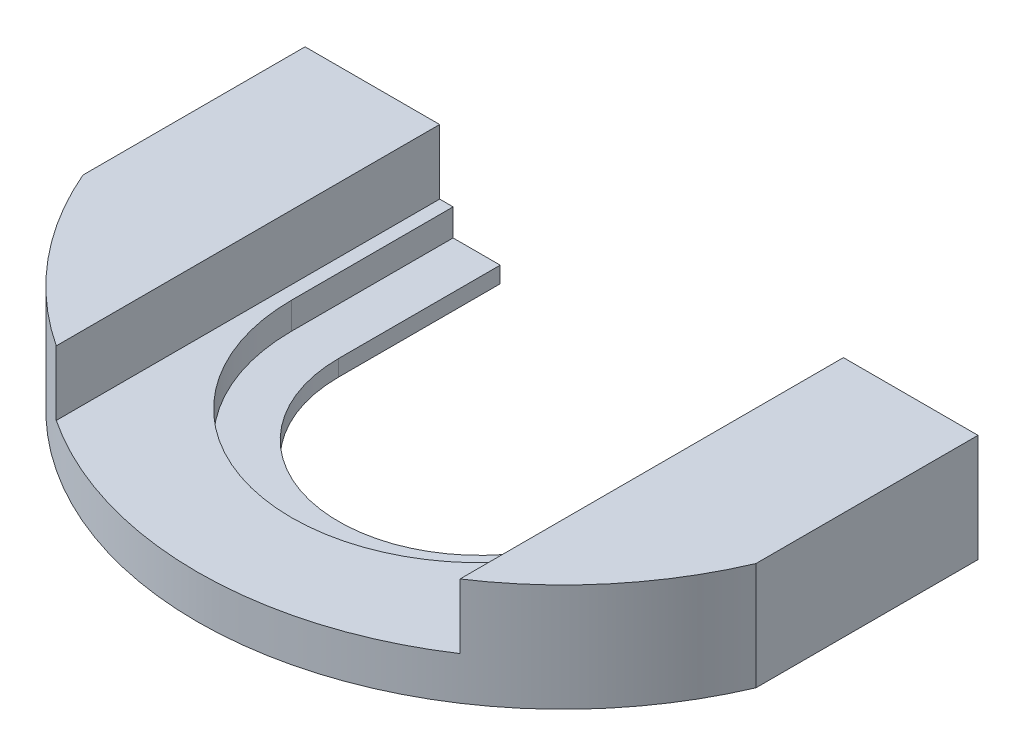
ISO-10303-21;
HEADER;
FILE_DESCRIPTION(('STEP AP214'),'2;1');
FILE_NAME('part.step','',(''),(''),'','','');
FILE_SCHEMA(('AUTOMOTIVE_DESIGN { 1 0 10303 214 1 1 1 1 }'));
ENDSEC;
DATA;
#1=APPLICATION_CONTEXT('core data for automotive mechanical design processes');
#2=APPLICATION_PROTOCOL_DEFINITION('international standard','automotive_design',2000,#1);
#3=PRODUCT_CONTEXT('',#1,'mechanical');
#4=PRODUCT('Part','Part','',(#3));
#5=PRODUCT_RELATED_PRODUCT_CATEGORY('part','',(#4));
#6=PRODUCT_DEFINITION_FORMATION('','',#4);
#7=PRODUCT_DEFINITION_CONTEXT('part definition',#1,'design');
#8=PRODUCT_DEFINITION('design','',#6,#7);
#9=PRODUCT_DEFINITION_SHAPE('','',#8);
#10=(LENGTH_UNIT() NAMED_UNIT(*) SI_UNIT(.MILLI.,.METRE.));
#11=(NAMED_UNIT(*) PLANE_ANGLE_UNIT() SI_UNIT($,.RADIAN.));
#12=(NAMED_UNIT(*) SI_UNIT($,.STERADIAN.) SOLID_ANGLE_UNIT());
#13=UNCERTAINTY_MEASURE_WITH_UNIT(LENGTH_MEASURE(1.E-05),#10,'distance_accuracy_value','');
#14=(GEOMETRIC_REPRESENTATION_CONTEXT(3) GLOBAL_UNCERTAINTY_ASSIGNED_CONTEXT((#13)) GLOBAL_UNIT_ASSIGNED_CONTEXT((#10,
#11,#12)) REPRESENTATION_CONTEXT('',''));
#15=CARTESIAN_POINT('',(0.,0.,0.));
#16=DIRECTION('',(0.,0.,1.));
#17=DIRECTION('',(1.,0.,0.));
#18=AXIS2_PLACEMENT_3D('',#15,#16,#17);
#19=CARTESIAN_POINT('',(-30.,1.2,33.));
#20=DIRECTION('',(0.,1.,0.));
#21=DIRECTION('',(-1.,0.,0.));
#22=AXIS2_PLACEMENT_3D('',#19,#20,#21);
#23=PLANE('',#22);
#24=DIRECTION('',(1.,0.,0.));
#25=VECTOR('',#24,1.);
#26=CARTESIAN_POINT('',(-30.,1.2,0.));
#27=LINE('',#26,#25);
#28=CARTESIAN_POINT('',(-29.,1.2,0.));
#29=VERTEX_POINT('',#28);
#30=CARTESIAN_POINT('',(-25.5,1.2,0.));
#31=VERTEX_POINT('',#30);
#32=EDGE_CURVE('E268',#29,#31,#27,.T.);
#33=ORIENTED_EDGE('',*,*,#32,.F.);
#34=DIRECTION('',(0.,0.,-1.));
#35=VECTOR('',#34,1.);
#36=CARTESIAN_POINT('',(-29.,1.2,0.));
#37=LINE('',#36,#35);
#38=CARTESIAN_POINT('',(-29.,1.2,12.));
#39=VERTEX_POINT('',#38);
#40=EDGE_CURVE('E132',#39,#29,#37,.T.);
#41=ORIENTED_EDGE('',*,*,#40,.F.);
#42=CARTESIAN_POINT('',(-15.,1.2,12.));
#43=DIRECTION('',(0.,1.,0.));
#44=DIRECTION('',(-1.,0.,0.));
#45=AXIS2_PLACEMENT_3D('',#42,#43,#44);
#46=CIRCLE('',#45,14.);
#47=CARTESIAN_POINT('',(-0.999999999999994,1.2,12.));
#48=VERTEX_POINT('',#47);
#49=EDGE_CURVE('E137',#39,#48,#46,.T.);
#50=ORIENTED_EDGE('',*,*,#49,.T.);
#51=DIRECTION('',(0.,0.,-1.));
#52=VECTOR('',#51,1.);
#53=CARTESIAN_POINT('',(-0.999999999999992,1.2,0.));
#54=LINE('',#53,#52);
#55=CARTESIAN_POINT('',(-0.999999999999994,1.2,0.));
#56=VERTEX_POINT('',#55);
#57=EDGE_CURVE('E365',#48,#56,#54,.T.);
#58=ORIENTED_EDGE('',*,*,#57,.T.);
#59=CARTESIAN_POINT('',(-4.49999999999999,1.2,0.));
#60=VERTEX_POINT('',#59);
#61=EDGE_CURVE('E265',#60,#56,#27,.T.);
#62=ORIENTED_EDGE('',*,*,#61,.F.);
#63=DIRECTION('',(0.,0.,1.));
#64=VECTOR('',#63,1.);
#65=CARTESIAN_POINT('',(-4.49999999999999,1.2,33.));
#66=LINE('',#65,#64);
#67=CARTESIAN_POINT('',(-4.49999999999999,1.2,12.));
#68=VERTEX_POINT('',#67);
#69=EDGE_CURVE('E125',#60,#68,#66,.T.);
#70=ORIENTED_EDGE('',*,*,#69,.T.);
#71=CARTESIAN_POINT('',(-15.,1.2,12.));
#72=DIRECTION('',(0.,1.,0.));
#73=DIRECTION('',(-1.,0.,0.));
#74=AXIS2_PLACEMENT_3D('',#71,#72,#73);
#75=CIRCLE('',#74,10.5);
#76=CARTESIAN_POINT('',(-25.5,1.19999999999999,12.));
#77=VERTEX_POINT('',#76);
#78=EDGE_CURVE('E312',#77,#68,#75,.T.);
#79=ORIENTED_EDGE('',*,*,#78,.F.);
#80=DIRECTION('',(0.,0.,1.));
#81=VECTOR('',#80,1.);
#82=CARTESIAN_POINT('',(-25.5,1.2,33.));
#83=LINE('',#82,#81);
#84=EDGE_CURVE('E317',#31,#77,#83,.T.);
#85=ORIENTED_EDGE('',*,*,#84,.F.);
#86=EDGE_LOOP('',(#33,#41,#50,#58,#62,#70,#79,#85));
#87=FACE_BOUND('',#86,.T.);
#88=ADVANCED_FACE('F118',(#87),#23,.T.);
#89=CARTESIAN_POINT('',(0.,0.,0.));
#90=DIRECTION('',(0.,0.,1.));
#91=DIRECTION('',(1.,0.,0.));
#92=AXIS2_PLACEMENT_3D('',#89,#90,#91);
#93=PLANE('',#92);
#94=CARTESIAN_POINT('',(4.99999999999999,4.00000000000001,0.));
#95=DIRECTION('',(0.,0.,-1.));
#96=DIRECTION('',(-1.,0.,0.));
#97=AXIS2_PLACEMENT_3D('',#94,#95,#96);
#98=CIRCLE('',#97,1.5);
#99=CARTESIAN_POINT('',(3.49999999999999,4.00000000000001,0.));
#100=VERTEX_POINT('',#99);
#101=EDGE_CURVE('E392',#100,#100,#98,.T.);
#102=ORIENTED_EDGE('',*,*,#101,.F.);
#103=EDGE_LOOP('',(#102));
#104=FACE_BOUND('',#103,.T.);
#105=ORIENTED_EDGE('',*,*,#61,.T.);
#106=DIRECTION('',(0.,-1.,0.));
#107=VECTOR('',#106,1.);
#108=CARTESIAN_POINT('',(-0.999999999999993,3.2,0.));
#109=LINE('',#108,#107);
#110=CARTESIAN_POINT('',(-0.999999999999993,3.2,0.));
#111=VERTEX_POINT('',#110);
#112=EDGE_CURVE('E360',#111,#56,#109,.T.);
#113=ORIENTED_EDGE('',*,*,#112,.F.);
#114=DIRECTION('',(-1.,0.,0.));
#115=VECTOR('',#114,1.);
#116=CARTESIAN_POINT('',(0.,3.2,0.));
#117=LINE('',#116,#115);
#118=CARTESIAN_POINT('',(0.,3.2,0.));
#119=VERTEX_POINT('',#118);
#120=EDGE_CURVE('E295',#119,#111,#117,.T.);
#121=ORIENTED_EDGE('',*,*,#120,.F.);
#122=DIRECTION('',(0.,1.,0.));
#123=VECTOR('',#122,1.);
#124=CARTESIAN_POINT('',(0.,0.,0.));
#125=LINE('',#124,#123);
#126=CARTESIAN_POINT('',(0.,8.00000000000001,0.));
#127=VERTEX_POINT('',#126);
#128=EDGE_CURVE('E271',#119,#127,#125,.T.);
#129=ORIENTED_EDGE('',*,*,#128,.T.);
#130=DIRECTION('',(1.,0.,0.));
#131=VECTOR('',#130,1.);
#132=CARTESIAN_POINT('',(0.,8.00000000000001,0.));
#133=LINE('',#132,#131);
#134=CARTESIAN_POINT('',(9.99999999999999,8.00000000000001,0.));
#135=VERTEX_POINT('',#134);
#136=EDGE_CURVE('E275',#127,#135,#133,.T.);
#137=ORIENTED_EDGE('',*,*,#136,.T.);
#138=DIRECTION('',(0.,1.,0.));
#139=VECTOR('',#138,1.);
#140=CARTESIAN_POINT('',(9.99999999999999,0.,0.));
#141=LINE('',#140,#139);
#142=CARTESIAN_POINT('',(9.99999999999999,0.,0.));
#143=VERTEX_POINT('',#142);
#144=EDGE_CURVE('E270',#143,#135,#141,.T.);
#145=ORIENTED_EDGE('',*,*,#144,.F.);
#146=DIRECTION('',(-1.,0.,0.));
#147=VECTOR('',#146,1.);
#148=CARTESIAN_POINT('',(0.,0.,0.));
#149=LINE('',#148,#147);
#150=CARTESIAN_POINT('',(-4.49999999999999,0.,0.));
#151=VERTEX_POINT('',#150);
#152=EDGE_CURVE('E252',#143,#151,#149,.T.);
#153=ORIENTED_EDGE('',*,*,#152,.T.);
#154=DIRECTION('',(0.,-1.,0.));
#155=VECTOR('',#154,1.);
#156=CARTESIAN_POINT('',(-4.5,30.,0.));
#157=LINE('',#156,#155);
#158=EDGE_CURVE('E331',#60,#151,#157,.T.);
#159=ORIENTED_EDGE('',*,*,#158,.F.);
#160=EDGE_LOOP('',(#105,#113,#121,#129,#137,#145,#153,#159));
#161=FACE_BOUND('',#160,.T.);
#162=ADVANCED_FACE('F293',(#104,#161),#93,.F.);
#163=CARTESIAN_POINT('',(0.,0.,33.));
#164=DIRECTION('',(0.,-1.,0.));
#165=DIRECTION('',(1.,0.,0.));
#166=AXIS2_PLACEMENT_3D('',#163,#164,#165);
#167=PLANE('',#166);
#168=DIRECTION('',(0.,0.,-1.));
#169=VECTOR('',#168,1.);
#170=CARTESIAN_POINT('',(9.99999999999999,0.,33.));
#171=LINE('',#170,#169);
#172=CARTESIAN_POINT('',(9.99999999999999,0.,16.5));
#173=VERTEX_POINT('',#172);
#174=EDGE_CURVE('E244',#173,#143,#171,.T.);
#175=ORIENTED_EDGE('',*,*,#174,.F.);
#176=CARTESIAN_POINT('',(-15.,0.,5.81060606060607));
#177=DIRECTION('',(0.,-1.,0.));
#178=DIRECTION('',(1.,0.,0.));
#179=AXIS2_PLACEMENT_3D('',#176,#177,#178);
#180=CIRCLE('',#179,27.1893939393939);
#181=CARTESIAN_POINT('',(-40.,0.,16.5));
#182=VERTEX_POINT('',#181);
#183=EDGE_CURVE('E227',#182,#173,#180,.F.);
#184=ORIENTED_EDGE('',*,*,#183,.F.);
#185=DIRECTION('',(0.,0.,-1.));
#186=VECTOR('',#185,1.);
#187=CARTESIAN_POINT('',(-40.,0.,33.));
#188=LINE('',#187,#186);
#189=CARTESIAN_POINT('',(-40.,0.,0.));
#190=VERTEX_POINT('',#189);
#191=EDGE_CURVE('E309',#182,#190,#188,.T.);
#192=ORIENTED_EDGE('',*,*,#191,.T.);
#193=CARTESIAN_POINT('',(-25.5,0.,0.));
#194=VERTEX_POINT('',#193);
#195=EDGE_CURVE('E348',#194,#190,#149,.T.);
#196=ORIENTED_EDGE('',*,*,#195,.F.);
#197=DIRECTION('',(0.,0.,-1.));
#198=VECTOR('',#197,1.);
#199=CARTESIAN_POINT('',(-25.5,0.,0.));
#200=LINE('',#199,#198);
#201=CARTESIAN_POINT('',(-25.5,0.,12.));
#202=VERTEX_POINT('',#201);
#203=EDGE_CURVE('E346',#202,#194,#200,.T.);
#204=ORIENTED_EDGE('',*,*,#203,.F.);
#205=CARTESIAN_POINT('',(-15.,0.,12.));
#206=DIRECTION('',(0.,-1.,0.));
#207=DIRECTION('',(1.,0.,0.));
#208=AXIS2_PLACEMENT_3D('',#205,#206,#207);
#209=CIRCLE('',#208,10.5);
#210=CARTESIAN_POINT('',(-4.49999999999999,0.,12.));
#211=VERTEX_POINT('',#210);
#212=EDGE_CURVE('E344',#211,#202,#209,.T.);
#213=ORIENTED_EDGE('',*,*,#212,.F.);
#214=DIRECTION('',(0.,0.,-1.));
#215=VECTOR('',#214,1.);
#216=CARTESIAN_POINT('',(-4.49999999999999,0.,0.));
#217=LINE('',#216,#215);
#218=EDGE_CURVE('E343',#211,#151,#217,.T.);
#219=ORIENTED_EDGE('',*,*,#218,.T.);
#220=ORIENTED_EDGE('',*,*,#152,.F.);
#221=EDGE_LOOP('',(#175,#184,#192,#196,#204,#213,#219,#220));
#222=FACE_BOUND('',#221,.T.);
#223=ADVANCED_FACE('F249',(#222),#167,.T.);
#224=CARTESIAN_POINT('',(-40.,0.,33.));
#225=DIRECTION('',(1.,0.,0.));
#226=DIRECTION('',(0.,0.,-1.));
#227=AXIS2_PLACEMENT_3D('',#224,#225,#226);
#228=PLANE('',#227);
#229=ORIENTED_EDGE('',*,*,#191,.F.);
#230=DIRECTION('',(0.,-1.,0.));
#231=VECTOR('',#230,1.);
#232=CARTESIAN_POINT('',(-40.,8.00000000000001,16.5));
#233=LINE('',#232,#231);
#234=CARTESIAN_POINT('',(-40.,8.00000000000001,16.5));
#235=VERTEX_POINT('',#234);
#236=EDGE_CURVE('E233',#235,#182,#233,.T.);
#237=ORIENTED_EDGE('',*,*,#236,.F.);
#238=DIRECTION('',(0.,0.,-1.));
#239=VECTOR('',#238,1.);
#240=CARTESIAN_POINT('',(-40.,7.99999999999999,33.));
#241=LINE('',#240,#239);
#242=CARTESIAN_POINT('',(-40.,7.99999999999999,0.));
#243=VERTEX_POINT('',#242);
#244=EDGE_CURVE('E303',#235,#243,#241,.T.);
#245=ORIENTED_EDGE('',*,*,#244,.T.);
#246=DIRECTION('',(0.,-1.,0.));
#247=VECTOR('',#246,1.);
#248=CARTESIAN_POINT('',(-40.,0.,0.));
#249=LINE('',#248,#247);
#250=EDGE_CURVE('E257',#243,#190,#249,.T.);
#251=ORIENTED_EDGE('',*,*,#250,.T.);
#252=EDGE_LOOP('',(#229,#237,#245,#251));
#253=FACE_BOUND('',#252,.T.);
#254=ADVANCED_FACE('F414',(#253),#228,.F.);
#255=CARTESIAN_POINT('',(0.,7.99999999999999,33.));
#256=DIRECTION('',(0.,-1.,0.));
#257=DIRECTION('',(0.,0.,-1.));
#258=AXIS2_PLACEMENT_3D('',#255,#256,#257);
#259=PLANE('',#258);
#260=ORIENTED_EDGE('',*,*,#244,.F.);
#261=CARTESIAN_POINT('',(-15.,8.00000000000002,5.81060606060607));
#262=DIRECTION('',(0.,-1.,0.));
#263=DIRECTION('',(1.,0.,0.));
#264=AXIS2_PLACEMENT_3D('',#261,#262,#263);
#265=CIRCLE('',#264,27.1893939393939);
#266=CARTESIAN_POINT('',(-30.,8.00000000000001,28.4879767810302));
#267=VERTEX_POINT('',#266);
#268=EDGE_CURVE('E237',#235,#267,#265,.F.);
#269=ORIENTED_EDGE('',*,*,#268,.T.);
#270=DIRECTION('',(0.,0.,-1.));
#271=VECTOR('',#270,1.);
#272=CARTESIAN_POINT('',(-30.,7.99999999999999,33.));
#273=LINE('',#272,#271);
#274=CARTESIAN_POINT('',(-30.,7.99999999999999,0.));
#275=VERTEX_POINT('',#274);
#276=EDGE_CURVE('E302',#267,#275,#273,.T.);
#277=ORIENTED_EDGE('',*,*,#276,.T.);
#278=DIRECTION('',(-1.,0.,0.));
#279=VECTOR('',#278,1.);
#280=CARTESIAN_POINT('',(0.,7.99999999999999,0.));
#281=LINE('',#280,#279);
#282=EDGE_CURVE('E254',#275,#243,#281,.T.);
#283=ORIENTED_EDGE('',*,*,#282,.T.);
#284=EDGE_LOOP('',(#260,#269,#277,#283));
#285=FACE_BOUND('',#284,.T.);
#286=ADVANCED_FACE('F413',(#285),#259,.F.);
#287=CARTESIAN_POINT('',(-35.,3.99999999999999,0.));
#288=DIRECTION('',(0.,0.,-1.));
#289=DIRECTION('',(-1.,0.,0.));
#290=AXIS2_PLACEMENT_3D('',#287,#288,#289);
#291=CIRCLE('',#290,1.5);
#292=CARTESIAN_POINT('',(-36.5,3.99999999999999,0.));
#293=VERTEX_POINT('',#292);
#294=EDGE_CURVE('E386',#293,#293,#291,.T.);
#295=ORIENTED_EDGE('',*,*,#294,.F.);
#296=EDGE_LOOP('',(#295));
#297=FACE_BOUND('',#296,.T.);
#298=DIRECTION('',(0.,-1.,0.));
#299=VECTOR('',#298,1.);
#300=CARTESIAN_POINT('',(-29.,3.2,0.));
#301=LINE('',#300,#299);
#302=CARTESIAN_POINT('',(-29.,3.2,0.));
#303=VERTEX_POINT('',#302);
#304=EDGE_CURVE('E358',#303,#29,#301,.T.);
#305=ORIENTED_EDGE('',*,*,#304,.T.);
#306=ORIENTED_EDGE('',*,*,#32,.T.);
#307=DIRECTION('',(0.,-1.,0.));
#308=VECTOR('',#307,1.);
#309=CARTESIAN_POINT('',(-25.5,30.,0.));
#310=LINE('',#309,#308);
#311=EDGE_CURVE('E334',#31,#194,#310,.T.);
#312=ORIENTED_EDGE('',*,*,#311,.T.);
#313=ORIENTED_EDGE('',*,*,#195,.T.);
#314=ORIENTED_EDGE('',*,*,#250,.F.);
#315=ORIENTED_EDGE('',*,*,#282,.F.);
#316=DIRECTION('',(0.,-1.,0.));
#317=VECTOR('',#316,1.);
#318=CARTESIAN_POINT('',(-30.,0.,0.));
#319=LINE('',#318,#317);
#320=CARTESIAN_POINT('',(-30.,3.2,0.));
#321=VERTEX_POINT('',#320);
#322=EDGE_CURVE('E298',#275,#321,#319,.T.);
#323=ORIENTED_EDGE('',*,*,#322,.T.);
#324=DIRECTION('',(-1.,0.,0.));
#325=VECTOR('',#324,1.);
#326=CARTESIAN_POINT('',(0.,3.2,0.));
#327=LINE('',#326,#325);
#328=EDGE_CURVE('E379',#303,#321,#327,.T.);
#329=ORIENTED_EDGE('',*,*,#328,.F.);
#330=EDGE_LOOP('',(#305,#306,#312,#313,#314,#315,#323,#329));
#331=FACE_BOUND('',#330,.T.);
#332=ADVANCED_FACE('F351',(#297,#331),#93,.F.);
#333=CARTESIAN_POINT('',(-30.,0.,33.));
#334=DIRECTION('',(1.,0.,0.));
#335=DIRECTION('',(0.,0.,-1.));
#336=AXIS2_PLACEMENT_3D('',#333,#334,#335);
#337=PLANE('',#336);
#338=DIRECTION('',(0.,-1.,0.));
#339=VECTOR('',#338,1.);
#340=CARTESIAN_POINT('',(-30.,8.00000000000002,28.4879767810302));
#341=LINE('',#340,#339);
#342=CARTESIAN_POINT('',(-30.,3.2,28.4879767810302));
#343=VERTEX_POINT('',#342);
#344=EDGE_CURVE('E395',#343,#267,#341,.F.);
#345=ORIENTED_EDGE('',*,*,#344,.F.);
#346=DIRECTION('',(0.,0.,1.));
#347=VECTOR('',#346,1.);
#348=CARTESIAN_POINT('',(-30.,3.2,0.));
#349=LINE('',#348,#347);
#350=EDGE_CURVE('E376',#321,#343,#349,.T.);
#351=ORIENTED_EDGE('',*,*,#350,.F.);
#352=ORIENTED_EDGE('',*,*,#322,.F.);
#353=ORIENTED_EDGE('',*,*,#276,.F.);
#354=EDGE_LOOP('',(#345,#351,#352,#353));
#355=FACE_BOUND('',#354,.T.);
#356=ADVANCED_FACE('F410',(#355),#337,.T.);
#357=CARTESIAN_POINT('',(9.99999999999999,0.,33.));
#358=DIRECTION('',(-1.,0.,0.));
#359=DIRECTION('',(0.,0.,1.));
#360=AXIS2_PLACEMENT_3D('',#357,#358,#359);
#361=PLANE('',#360);
#362=DIRECTION('',(0.,0.,-1.));
#363=VECTOR('',#362,1.);
#364=CARTESIAN_POINT('',(9.99999999999999,8.00000000000001,33.));
#365=LINE('',#364,#363);
#366=CARTESIAN_POINT('',(9.99999999999999,8.00000000000002,16.5));
#367=VERTEX_POINT('',#366);
#368=EDGE_CURVE('E246',#367,#135,#365,.T.);
#369=ORIENTED_EDGE('',*,*,#368,.F.);
#370=DIRECTION('',(0.,-1.,0.));
#371=VECTOR('',#370,1.);
#372=CARTESIAN_POINT('',(9.99999999999999,8.00000000000002,16.5));
#373=LINE('',#372,#371);
#374=EDGE_CURVE('E230',#367,#173,#373,.T.);
#375=ORIENTED_EDGE('',*,*,#374,.T.);
#376=ORIENTED_EDGE('',*,*,#174,.T.);
#377=ORIENTED_EDGE('',*,*,#144,.T.);
#378=EDGE_LOOP('',(#369,#375,#376,#377));
#379=FACE_BOUND('',#378,.T.);
#380=ADVANCED_FACE('F242',(#379),#361,.F.);
#381=CARTESIAN_POINT('',(0.,8.00000000000001,33.));
#382=DIRECTION('',(0.,1.,0.));
#383=DIRECTION('',(0.,0.,1.));
#384=AXIS2_PLACEMENT_3D('',#381,#382,#383);
#385=PLANE('',#384);
#386=CARTESIAN_POINT('',(-15.,8.00000000000002,5.81060606060607));
#387=DIRECTION('',(0.,-1.,0.));
#388=DIRECTION('',(1.,0.,0.));
#389=AXIS2_PLACEMENT_3D('',#386,#387,#388);
#390=CIRCLE('',#389,27.1893939393939);
#391=CARTESIAN_POINT('',(0.,8.00000000000002,28.4879767810302));
#392=VERTEX_POINT('',#391);
#393=EDGE_CURVE('E247',#392,#367,#390,.F.);
#394=ORIENTED_EDGE('',*,*,#393,.T.);
#395=ORIENTED_EDGE('',*,*,#368,.T.);
#396=ORIENTED_EDGE('',*,*,#136,.F.);
#397=DIRECTION('',(0.,0.,-1.));
#398=VECTOR('',#397,1.);
#399=CARTESIAN_POINT('',(0.,8.00000000000001,33.));
#400=LINE('',#399,#398);
#401=EDGE_CURVE('E259',#392,#127,#400,.T.);
#402=ORIENTED_EDGE('',*,*,#401,.F.);
#403=EDGE_LOOP('',(#394,#395,#396,#402));
#404=FACE_BOUND('',#403,.T.);
#405=ADVANCED_FACE('F296',(#404),#385,.T.);
#406=CARTESIAN_POINT('',(0.,0.,33.));
#407=DIRECTION('',(-1.,0.,0.));
#408=DIRECTION('',(0.,0.,1.));
#409=AXIS2_PLACEMENT_3D('',#406,#407,#408);
#410=PLANE('',#409);
#411=DIRECTION('',(0.,-1.,0.));
#412=VECTOR('',#411,1.);
#413=CARTESIAN_POINT('',(0.,8.00000000000002,28.4879767810302));
#414=LINE('',#413,#412);
#415=CARTESIAN_POINT('',(0.,3.2,28.4879767810302));
#416=VERTEX_POINT('',#415);
#417=EDGE_CURVE('E238',#392,#416,#414,.T.);
#418=ORIENTED_EDGE('',*,*,#417,.F.);
#419=ORIENTED_EDGE('',*,*,#401,.T.);
#420=ORIENTED_EDGE('',*,*,#128,.F.);
#421=DIRECTION('',(0.,0.,-1.));
#422=VECTOR('',#421,1.);
#423=CARTESIAN_POINT('',(0.,3.2,0.));
#424=LINE('',#423,#422);
#425=EDGE_CURVE('E374',#416,#119,#424,.T.);
#426=ORIENTED_EDGE('',*,*,#425,.F.);
#427=EDGE_LOOP('',(#418,#419,#420,#426));
#428=FACE_BOUND('',#427,.T.);
#429=ADVANCED_FACE('F284',(#428),#410,.T.);
#430=CARTESIAN_POINT('',(-4.5,30.,0.));
#431=DIRECTION('',(-1.,0.,0.));
#432=DIRECTION('',(0.,-1.,0.));
#433=AXIS2_PLACEMENT_3D('',#430,#431,#432);
#434=PLANE('',#433);
#435=ORIENTED_EDGE('',*,*,#158,.T.);
#436=ORIENTED_EDGE('',*,*,#218,.F.);
#437=DIRECTION('',(0.,-1.,0.));
#438=VECTOR('',#437,1.);
#439=CARTESIAN_POINT('',(-4.5,30.,12.));
#440=LINE('',#439,#438);
#441=EDGE_CURVE('E332',#68,#211,#440,.T.);
#442=ORIENTED_EDGE('',*,*,#441,.F.);
#443=ORIENTED_EDGE('',*,*,#69,.F.);
#444=EDGE_LOOP('',(#435,#436,#442,#443));
#445=FACE_BOUND('',#444,.T.);
#446=ADVANCED_FACE('F329',(#445),#434,.T.);
#447=CARTESIAN_POINT('',(-25.5,30.,0.));
#448=DIRECTION('',(-1.,0.,0.));
#449=DIRECTION('',(0.,0.,1.));
#450=AXIS2_PLACEMENT_3D('',#447,#448,#449);
#451=PLANE('',#450);
#452=ORIENTED_EDGE('',*,*,#84,.T.);
#453=DIRECTION('',(0.,-1.,0.));
#454=VECTOR('',#453,1.);
#455=CARTESIAN_POINT('',(-25.5,30.,12.));
#456=LINE('',#455,#454);
#457=EDGE_CURVE('E338',#77,#202,#456,.T.);
#458=ORIENTED_EDGE('',*,*,#457,.T.);
#459=ORIENTED_EDGE('',*,*,#203,.T.);
#460=ORIENTED_EDGE('',*,*,#311,.F.);
#461=EDGE_LOOP('',(#452,#458,#459,#460));
#462=FACE_BOUND('',#461,.T.);
#463=ADVANCED_FACE('F470',(#462),#451,.F.);
#464=CARTESIAN_POINT('',(-15.,30.,12.));
#465=DIRECTION('',(0.,-1.,0.));
#466=DIRECTION('',(1.,0.,0.));
#467=AXIS2_PLACEMENT_3D('',#464,#465,#466);
#468=CYLINDRICAL_SURFACE('',#467,10.5);
#469=ORIENTED_EDGE('',*,*,#78,.T.);
#470=ORIENTED_EDGE('',*,*,#441,.T.);
#471=ORIENTED_EDGE('',*,*,#212,.T.);
#472=ORIENTED_EDGE('',*,*,#457,.F.);
#473=EDGE_LOOP('',(#469,#470,#471,#472));
#474=FACE_BOUND('',#473,.T.);
#475=ADVANCED_FACE('F468',(#474),#468,.F.);
#476=CARTESIAN_POINT('',(-15.,3.2,12.));
#477=DIRECTION('',(0.,-1.,0.));
#478=DIRECTION('',(1.,0.,0.));
#479=AXIS2_PLACEMENT_3D('',#476,#477,#478);
#480=CYLINDRICAL_SURFACE('',#479,14.);
#481=ORIENTED_EDGE('',*,*,#49,.F.);
#482=DIRECTION('',(0.,-1.,0.));
#483=VECTOR('',#482,1.);
#484=CARTESIAN_POINT('',(-29.,3.2,12.));
#485=LINE('',#484,#483);
#486=CARTESIAN_POINT('',(-29.,3.2,12.));
#487=VERTEX_POINT('',#486);
#488=EDGE_CURVE('E347',#487,#39,#485,.T.);
#489=ORIENTED_EDGE('',*,*,#488,.F.);
#490=CARTESIAN_POINT('',(-15.,3.2,12.));
#491=DIRECTION('',(0.,1.,0.));
#492=DIRECTION('',(-1.,0.,0.));
#493=AXIS2_PLACEMENT_3D('',#490,#491,#492);
#494=CIRCLE('',#493,14.);
#495=CARTESIAN_POINT('',(-0.999999999999993,3.2,12.));
#496=VERTEX_POINT('',#495);
#497=EDGE_CURVE('E367',#487,#496,#494,.T.);
#498=ORIENTED_EDGE('',*,*,#497,.T.);
#499=DIRECTION('',(0.,-1.,0.));
#500=VECTOR('',#499,1.);
#501=CARTESIAN_POINT('',(-0.999999999999993,3.2,12.));
#502=LINE('',#501,#500);
#503=EDGE_CURVE('E362',#496,#48,#502,.T.);
#504=ORIENTED_EDGE('',*,*,#503,.T.);
#505=EDGE_LOOP('',(#481,#489,#498,#504));
#506=FACE_BOUND('',#505,.T.);
#507=ADVANCED_FACE('F464',(#506),#480,.F.);
#508=CARTESIAN_POINT('',(-29.,3.2,0.));
#509=DIRECTION('',(-1.,0.,0.));
#510=DIRECTION('',(0.,-1.,0.));
#511=AXIS2_PLACEMENT_3D('',#508,#509,#510);
#512=PLANE('',#511);
#513=ORIENTED_EDGE('',*,*,#40,.T.);
#514=ORIENTED_EDGE('',*,*,#304,.F.);
#515=DIRECTION('',(0.,0.,-1.));
#516=VECTOR('',#515,1.);
#517=CARTESIAN_POINT('',(-29.,3.2,0.));
#518=LINE('',#517,#516);
#519=EDGE_CURVE('E382',#487,#303,#518,.T.);
#520=ORIENTED_EDGE('',*,*,#519,.F.);
#521=ORIENTED_EDGE('',*,*,#488,.T.);
#522=EDGE_LOOP('',(#513,#514,#520,#521));
#523=FACE_BOUND('',#522,.T.);
#524=ADVANCED_FACE('F460',(#523),#512,.F.);
#525=CARTESIAN_POINT('',(-0.999999999999993,3.2,0.));
#526=DIRECTION('',(-1.,0.,0.));
#527=DIRECTION('',(0.,-1.,0.));
#528=AXIS2_PLACEMENT_3D('',#525,#526,#527);
#529=PLANE('',#528);
#530=ORIENTED_EDGE('',*,*,#57,.F.);
#531=ORIENTED_EDGE('',*,*,#503,.F.);
#532=DIRECTION('',(0.,0.,-1.));
#533=VECTOR('',#532,1.);
#534=CARTESIAN_POINT('',(-0.999999999999993,3.2,0.));
#535=LINE('',#534,#533);
#536=EDGE_CURVE('E364',#496,#111,#535,.T.);
#537=ORIENTED_EDGE('',*,*,#536,.T.);
#538=ORIENTED_EDGE('',*,*,#112,.T.);
#539=EDGE_LOOP('',(#530,#531,#537,#538));
#540=FACE_BOUND('',#539,.T.);
#541=ADVANCED_FACE('F453',(#540),#529,.T.);
#542=CARTESIAN_POINT('',(0.,3.2,0.));
#543=DIRECTION('',(0.,1.,0.));
#544=DIRECTION('',(-1.,0.,0.));
#545=AXIS2_PLACEMENT_3D('',#542,#543,#544);
#546=PLANE('',#545);
#547=CARTESIAN_POINT('',(-15.,3.2,5.81060606060607));
#548=DIRECTION('',(0.,1.,0.));
#549=DIRECTION('',(-1.,0.,0.));
#550=AXIS2_PLACEMENT_3D('',#547,#548,#549);
#551=CIRCLE('',#550,27.1893939393939);
#552=EDGE_CURVE('E12',#416,#343,#551,.F.);
#553=ORIENTED_EDGE('',*,*,#552,.F.);
#554=ORIENTED_EDGE('',*,*,#425,.T.);
#555=ORIENTED_EDGE('',*,*,#120,.T.);
#556=ORIENTED_EDGE('',*,*,#536,.F.);
#557=ORIENTED_EDGE('',*,*,#497,.F.);
#558=ORIENTED_EDGE('',*,*,#519,.T.);
#559=ORIENTED_EDGE('',*,*,#328,.T.);
#560=ORIENTED_EDGE('',*,*,#350,.T.);
#561=EDGE_LOOP('',(#553,#554,#555,#556,#557,#558,#559,#560));
#562=FACE_BOUND('',#561,.T.);
#563=ADVANCED_FACE('F405',(#562),#546,.T.);
#564=CARTESIAN_POINT('',(-35.,3.99999999999999,10.));
#565=DIRECTION('',(0.,0.,-1.));
#566=DIRECTION('',(-1.,0.,0.));
#567=AXIS2_PLACEMENT_3D('',#564,#565,#566);
#568=CYLINDRICAL_SURFACE('',#567,1.5);
#569=CARTESIAN_POINT('',(-35.,3.99999999999999,10.));
#570=DIRECTION('',(0.,0.,-1.));
#571=DIRECTION('',(-1.,0.,0.));
#572=AXIS2_PLACEMENT_3D('',#569,#570,#571);
#573=CIRCLE('',#572,1.5);
#574=CARTESIAN_POINT('',(-36.5,3.99999999999999,10.));
#575=VERTEX_POINT('',#574);
#576=EDGE_CURVE('E370',#575,#575,#573,.T.);
#577=ORIENTED_EDGE('',*,*,#576,.F.);
#578=EDGE_LOOP('',(#577));
#579=FACE_BOUND('',#578,.T.);
#580=ORIENTED_EDGE('',*,*,#294,.T.);
#581=EDGE_LOOP('',(#580));
#582=FACE_BOUND('',#581,.T.);
#583=ADVANCED_FACE('F441',(#579,#582),#568,.F.);
#584=CARTESIAN_POINT('',(-35.,3.99999999999999,10.));
#585=DIRECTION('',(0.,0.,-1.));
#586=DIRECTION('',(-1.,0.,0.));
#587=AXIS2_PLACEMENT_3D('',#584,#585,#586);
#588=PLANE('',#587);
#589=ORIENTED_EDGE('',*,*,#576,.T.);
#590=EDGE_LOOP('',(#589));
#591=FACE_BOUND('',#590,.T.);
#592=ADVANCED_FACE('F443',(#591),#588,.T.);
#593=CARTESIAN_POINT('',(4.99999999999999,4.00000000000001,10.));
#594=DIRECTION('',(0.,0.,-1.));
#595=DIRECTION('',(-1.,0.,0.));
#596=AXIS2_PLACEMENT_3D('',#593,#594,#595);
#597=CYLINDRICAL_SURFACE('',#596,1.5);
#598=CARTESIAN_POINT('',(4.99999999999999,4.00000000000001,10.));
#599=DIRECTION('',(0.,0.,-1.));
#600=DIRECTION('',(-1.,0.,0.));
#601=AXIS2_PLACEMENT_3D('',#598,#599,#600);
#602=CIRCLE('',#601,1.5);
#603=CARTESIAN_POINT('',(3.49999999999999,4.00000000000001,10.));
#604=VERTEX_POINT('',#603);
#605=EDGE_CURVE('E389',#604,#604,#602,.T.);
#606=ORIENTED_EDGE('',*,*,#605,.F.);
#607=EDGE_LOOP('',(#606));
#608=FACE_BOUND('',#607,.T.);
#609=ORIENTED_EDGE('',*,*,#101,.T.);
#610=EDGE_LOOP('',(#609));
#611=FACE_BOUND('',#610,.T.);
#612=ADVANCED_FACE('F450',(#608,#611),#597,.F.);
#613=CARTESIAN_POINT('',(4.99999999999999,4.00000000000001,10.));
#614=DIRECTION('',(0.,0.,-1.));
#615=DIRECTION('',(-1.,0.,0.));
#616=AXIS2_PLACEMENT_3D('',#613,#614,#615);
#617=PLANE('',#616);
#618=ORIENTED_EDGE('',*,*,#605,.T.);
#619=EDGE_LOOP('',(#618));
#620=FACE_BOUND('',#619,.T.);
#621=ADVANCED_FACE('F514',(#620),#617,.T.);
#622=CARTESIAN_POINT('',(-15.,8.00000000000002,5.81060606060607));
#623=DIRECTION('',(0.,-1.,0.));
#624=DIRECTION('',(1.,0.,0.));
#625=AXIS2_PLACEMENT_3D('',#622,#623,#624);
#626=CYLINDRICAL_SURFACE('',#625,27.1893939393939);
#627=ORIENTED_EDGE('',*,*,#344,.T.);
#628=ORIENTED_EDGE('',*,*,#268,.F.);
#629=ORIENTED_EDGE('',*,*,#236,.T.);
#630=ORIENTED_EDGE('',*,*,#183,.T.);
#631=ORIENTED_EDGE('',*,*,#374,.F.);
#632=ORIENTED_EDGE('',*,*,#393,.F.);
#633=ORIENTED_EDGE('',*,*,#417,.T.);
#634=ORIENTED_EDGE('',*,*,#552,.T.);
#635=EDGE_LOOP('',(#627,#628,#629,#630,#631,#632,#633,#634));
#636=FACE_BOUND('',#635,.T.);
#637=ADVANCED_FACE('F229',(#636),#626,.T.);
#638=CLOSED_SHELL('',(#88,#162,#223,#254,#286,#332,#356,#380,#405,#429,#446,#463,#475,#507,#524,
#541,#563,#583,#592,#612,#621,#637));
#639=MANIFOLD_SOLID_BREP('B2',#638);
#640=ADVANCED_BREP_SHAPE_REPRESENTATION('',(#18,#639),#14);
#641=SHAPE_DEFINITION_REPRESENTATION(#9,#640);
ENDSEC;
END-ISO-10303-21;
